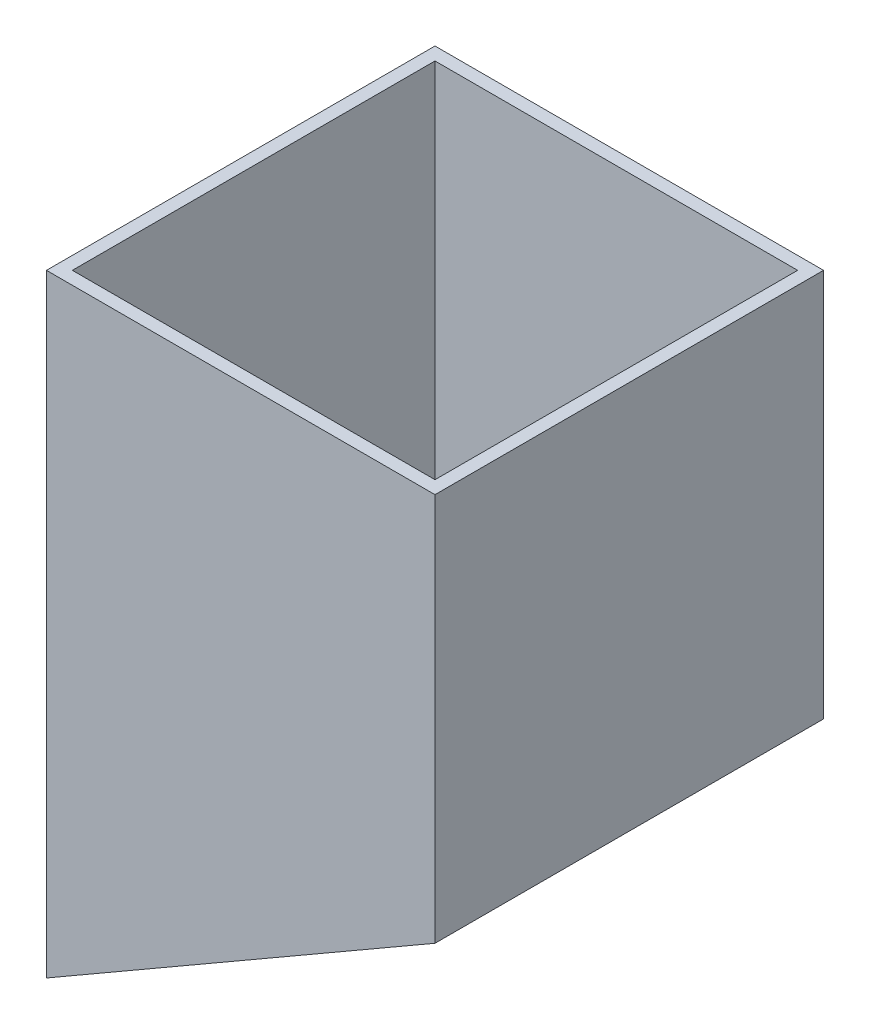
ISO-10303-21;
HEADER;
FILE_DESCRIPTION(('STEP AP214'),'2;1');
FILE_NAME('part.step','',(''),(''),'','','');
FILE_SCHEMA(('AUTOMOTIVE_DESIGN { 1 0 10303 214 1 1 1 1 }'));
ENDSEC;
DATA;
#1=APPLICATION_CONTEXT('core data for automotive mechanical design processes');
#2=APPLICATION_PROTOCOL_DEFINITION('international standard','automotive_design',2000,#1);
#3=PRODUCT_CONTEXT('',#1,'mechanical');
#4=PRODUCT('Part','Part','',(#3));
#5=PRODUCT_RELATED_PRODUCT_CATEGORY('part','',(#4));
#6=PRODUCT_DEFINITION_FORMATION('','',#4);
#7=PRODUCT_DEFINITION_CONTEXT('part definition',#1,'design');
#8=PRODUCT_DEFINITION('design','',#6,#7);
#9=PRODUCT_DEFINITION_SHAPE('','',#8);
#10=(LENGTH_UNIT() NAMED_UNIT(*) SI_UNIT(.MILLI.,.METRE.));
#11=(NAMED_UNIT(*) PLANE_ANGLE_UNIT() SI_UNIT($,.RADIAN.));
#12=(NAMED_UNIT(*) SI_UNIT($,.STERADIAN.) SOLID_ANGLE_UNIT());
#13=UNCERTAINTY_MEASURE_WITH_UNIT(LENGTH_MEASURE(1.E-05),#10,'distance_accuracy_value','');
#14=(GEOMETRIC_REPRESENTATION_CONTEXT(3) GLOBAL_UNCERTAINTY_ASSIGNED_CONTEXT((#13)) GLOBAL_UNIT_ASSIGNED_CONTEXT((#10,
#11,#12)) REPRESENTATION_CONTEXT('',''));
#15=CARTESIAN_POINT('',(0.,0.,0.));
#16=DIRECTION('',(0.,0.,1.));
#17=DIRECTION('',(1.,0.,0.));
#18=AXIS2_PLACEMENT_3D('',#15,#16,#17);
#19=CARTESIAN_POINT('',(0.,300.,0.));
#20=DIRECTION('',(0.,-1.,0.));
#21=DIRECTION('',(0.,0.,-1.));
#22=AXIS2_PLACEMENT_3D('',#19,#20,#21);
#23=PLANE('',#22);
#24=DIRECTION('',(0.,0.,1.));
#25=VECTOR('',#24,1.);
#26=CARTESIAN_POINT('',(0.,300.,0.));
#27=LINE('',#26,#25);
#28=CARTESIAN_POINT('',(0.,300.,-300.));
#29=VERTEX_POINT('',#28);
#30=CARTESIAN_POINT('',(0.,300.,0.));
#31=VERTEX_POINT('',#30);
#32=EDGE_CURVE('E94',#29,#31,#27,.T.);
#33=ORIENTED_EDGE('',*,*,#32,.T.);
#34=DIRECTION('',(1.,0.,0.));
#35=VECTOR('',#34,1.);
#36=CARTESIAN_POINT('',(0.,300.,0.));
#37=LINE('',#36,#35);
#38=CARTESIAN_POINT('',(300.,300.,0.));
#39=VERTEX_POINT('',#38);
#40=EDGE_CURVE('E88',#31,#39,#37,.T.);
#41=ORIENTED_EDGE('',*,*,#40,.T.);
#42=DIRECTION('',(0.,0.,-1.));
#43=VECTOR('',#42,1.);
#44=CARTESIAN_POINT('',(300.,300.,0.));
#45=LINE('',#44,#43);
#46=CARTESIAN_POINT('',(300.,300.,-300.));
#47=VERTEX_POINT('',#46);
#48=EDGE_CURVE('E91',#39,#47,#45,.T.);
#49=ORIENTED_EDGE('',*,*,#48,.T.);
#50=DIRECTION('',(-1.,0.,0.));
#51=VECTOR('',#50,1.);
#52=CARTESIAN_POINT('',(0.,300.,-300.));
#53=LINE('',#52,#51);
#54=EDGE_CURVE('E59',#47,#29,#53,.T.);
#55=ORIENTED_EDGE('',*,*,#54,.T.);
#56=EDGE_LOOP('',(#33,#41,#49,#55));
#57=FACE_BOUND('',#56,.T.);
#58=DIRECTION('',(0.,0.,1.));
#59=VECTOR('',#58,1.);
#60=CARTESIAN_POINT('',(10.,300.,0.));
#61=LINE('',#60,#59);
#62=CARTESIAN_POINT('',(9.99999999999995,300.,-290.));
#63=VERTEX_POINT('',#62);
#64=CARTESIAN_POINT('',(10.,300.,-10.));
#65=VERTEX_POINT('',#64);
#66=EDGE_CURVE('E129',#63,#65,#61,.T.);
#67=ORIENTED_EDGE('',*,*,#66,.F.);
#68=DIRECTION('',(-1.,0.,0.));
#69=VECTOR('',#68,1.);
#70=CARTESIAN_POINT('',(0.,300.,-290.));
#71=LINE('',#70,#69);
#72=CARTESIAN_POINT('',(290.,300.,-290.));
#73=VERTEX_POINT('',#72);
#74=EDGE_CURVE('E121',#73,#63,#71,.T.);
#75=ORIENTED_EDGE('',*,*,#74,.F.);
#76=DIRECTION('',(0.,0.,-1.));
#77=VECTOR('',#76,1.);
#78=CARTESIAN_POINT('',(290.,300.,0.));
#79=LINE('',#78,#77);
#80=CARTESIAN_POINT('',(290.,300.,-10.));
#81=VERTEX_POINT('',#80);
#82=EDGE_CURVE('E124',#81,#73,#79,.T.);
#83=ORIENTED_EDGE('',*,*,#82,.F.);
#84=DIRECTION('',(1.,0.,0.));
#85=VECTOR('',#84,1.);
#86=CARTESIAN_POINT('',(0.,300.,-10.));
#87=LINE('',#86,#85);
#88=EDGE_CURVE('E126',#65,#81,#87,.T.);
#89=ORIENTED_EDGE('',*,*,#88,.F.);
#90=EDGE_LOOP('',(#67,#75,#83,#89));
#91=FACE_BOUND('',#90,.T.);
#92=ADVANCED_FACE('F35',(#57,#91),#23,.F.);
#93=CARTESIAN_POINT('',(0.,300.,0.));
#94=DIRECTION('',(1.,0.,0.));
#95=DIRECTION('',(0.,0.,-1.));
#96=AXIS2_PLACEMENT_3D('',#93,#94,#95);
#97=PLANE('',#96);
#98=DIRECTION('',(0.,-1.,0.));
#99=VECTOR('',#98,1.);
#100=CARTESIAN_POINT('',(0.,300.,-300.));
#101=LINE('',#100,#99);
#102=CARTESIAN_POINT('',(0.,-173.205080756885,-300.));
#103=VERTEX_POINT('',#102);
#104=EDGE_CURVE('E104',#29,#103,#101,.T.);
#105=ORIENTED_EDGE('',*,*,#104,.T.);
#106=DIRECTION('',(0.,0.,1.));
#107=VECTOR('',#106,1.);
#108=CARTESIAN_POINT('',(0.,-173.205080756885,-646.410161513774));
#109=LINE('',#108,#107);
#110=CARTESIAN_POINT('',(0.,-173.205080756885,0.));
#111=VERTEX_POINT('',#110);
#112=EDGE_CURVE('E116',#103,#111,#109,.T.);
#113=ORIENTED_EDGE('',*,*,#112,.T.);
#114=DIRECTION('',(0.,-1.,0.));
#115=VECTOR('',#114,1.);
#116=CARTESIAN_POINT('',(0.,300.,0.));
#117=LINE('',#116,#115);
#118=EDGE_CURVE('E11',#31,#111,#117,.T.);
#119=ORIENTED_EDGE('',*,*,#118,.F.);
#120=ORIENTED_EDGE('',*,*,#32,.F.);
#121=EDGE_LOOP('',(#105,#113,#119,#120));
#122=FACE_BOUND('',#121,.T.);
#123=ADVANCED_FACE('F37',(#122),#97,.F.);
#124=CARTESIAN_POINT('',(0.,300.,0.));
#125=DIRECTION('',(0.,0.,-1.));
#126=DIRECTION('',(-1.,0.,0.));
#127=AXIS2_PLACEMENT_3D('',#124,#125,#126);
#128=PLANE('',#127);
#129=ORIENTED_EDGE('',*,*,#118,.T.);
#130=DIRECTION('',(0.866025403784441,0.499999999999995,0.));
#131=VECTOR('',#130,1.);
#132=CARTESIAN_POINT('',(0.,-173.205080756885,0.));
#133=LINE('',#132,#131);
#134=CARTESIAN_POINT('',(300.,0.,0.));
#135=VERTEX_POINT('',#134);
#136=EDGE_CURVE('E71',#111,#135,#133,.T.);
#137=ORIENTED_EDGE('',*,*,#136,.T.);
#138=DIRECTION('',(0.,-1.,0.));
#139=VECTOR('',#138,1.);
#140=CARTESIAN_POINT('',(300.,300.,0.));
#141=LINE('',#140,#139);
#142=EDGE_CURVE('E43',#39,#135,#141,.T.);
#143=ORIENTED_EDGE('',*,*,#142,.F.);
#144=ORIENTED_EDGE('',*,*,#40,.F.);
#145=EDGE_LOOP('',(#129,#137,#143,#144));
#146=FACE_BOUND('',#145,.T.);
#147=ADVANCED_FACE('F98',(#146),#128,.F.);
#148=CARTESIAN_POINT('',(300.,300.,0.));
#149=DIRECTION('',(-1.,0.,0.));
#150=DIRECTION('',(0.,0.,1.));
#151=AXIS2_PLACEMENT_3D('',#148,#149,#150);
#152=PLANE('',#151);
#153=DIRECTION('',(0.,0.,-1.));
#154=VECTOR('',#153,1.);
#155=CARTESIAN_POINT('',(300.,0.,0.));
#156=LINE('',#155,#154);
#157=CARTESIAN_POINT('',(300.,0.,-300.));
#158=VERTEX_POINT('',#157);
#159=EDGE_CURVE('E108',#135,#158,#156,.T.);
#160=ORIENTED_EDGE('',*,*,#159,.T.);
#161=DIRECTION('',(0.,-1.,0.));
#162=VECTOR('',#161,1.);
#163=CARTESIAN_POINT('',(300.,300.,-300.));
#164=LINE('',#163,#162);
#165=EDGE_CURVE('E100',#47,#158,#164,.T.);
#166=ORIENTED_EDGE('',*,*,#165,.F.);
#167=ORIENTED_EDGE('',*,*,#48,.F.);
#168=ORIENTED_EDGE('',*,*,#142,.T.);
#169=EDGE_LOOP('',(#160,#166,#167,#168));
#170=FACE_BOUND('',#169,.T.);
#171=ADVANCED_FACE('F101',(#170),#152,.F.);
#172=CARTESIAN_POINT('',(0.,300.,-300.));
#173=DIRECTION('',(0.,0.,1.));
#174=DIRECTION('',(1.,0.,0.));
#175=AXIS2_PLACEMENT_3D('',#172,#173,#174);
#176=PLANE('',#175);
#177=ORIENTED_EDGE('',*,*,#165,.T.);
#178=DIRECTION('',(-0.866025403784442,-0.499999999999995,0.));
#179=VECTOR('',#178,1.);
#180=CARTESIAN_POINT('',(0.,-173.205080756885,-300.));
#181=LINE('',#180,#179);
#182=EDGE_CURVE('E81',#158,#103,#181,.T.);
#183=ORIENTED_EDGE('',*,*,#182,.T.);
#184=ORIENTED_EDGE('',*,*,#104,.F.);
#185=ORIENTED_EDGE('',*,*,#54,.F.);
#186=EDGE_LOOP('',(#177,#183,#184,#185));
#187=FACE_BOUND('',#186,.T.);
#188=ADVANCED_FACE('F112',(#187),#176,.F.);
#189=CARTESIAN_POINT('',(0.,-173.205080756885,-646.410161513774));
#190=DIRECTION('',(0.499999999999995,-0.866025403784442,0.));
#191=DIRECTION('',(0.866025403784442,0.499999999999995,0.));
#192=AXIS2_PLACEMENT_3D('',#189,#190,#191);
#193=PLANE('',#192);
#194=ORIENTED_EDGE('',*,*,#182,.F.);
#195=ORIENTED_EDGE('',*,*,#159,.F.);
#196=ORIENTED_EDGE('',*,*,#136,.F.);
#197=ORIENTED_EDGE('',*,*,#112,.F.);
#198=EDGE_LOOP('',(#194,#195,#196,#197));
#199=FACE_BOUND('',#198,.T.);
#200=ADVANCED_FACE('F184',(#199),#193,.T.);
#201=CARTESIAN_POINT('',(10.,300.,0.));
#202=DIRECTION('',(1.,0.,0.));
#203=DIRECTION('',(0.,0.,-1.));
#204=AXIS2_PLACEMENT_3D('',#201,#202,#203);
#205=PLANE('',#204);
#206=DIRECTION('',(0.,-1.,0.));
#207=VECTOR('',#206,1.);
#208=CARTESIAN_POINT('',(9.99999999999995,300.,-290.));
#209=LINE('',#208,#207);
#210=CARTESIAN_POINT('',(9.99999999999995,-155.884572681197,-290.));
#211=VERTEX_POINT('',#210);
#212=EDGE_CURVE('E123',#63,#211,#209,.T.);
#213=ORIENTED_EDGE('',*,*,#212,.F.);
#214=ORIENTED_EDGE('',*,*,#66,.T.);
#215=DIRECTION('',(0.,-1.,0.));
#216=VECTOR('',#215,1.);
#217=CARTESIAN_POINT('',(10.,300.,-10.));
#218=LINE('',#217,#216);
#219=CARTESIAN_POINT('',(10.,-155.884572681197,-10.));
#220=VERTEX_POINT('',#219);
#221=EDGE_CURVE('E119',#65,#220,#218,.T.);
#222=ORIENTED_EDGE('',*,*,#221,.T.);
#223=DIRECTION('',(0.,0.,1.));
#224=VECTOR('',#223,1.);
#225=CARTESIAN_POINT('',(9.99999999999988,-155.884572681197,-646.410161513774));
#226=LINE('',#225,#224);
#227=EDGE_CURVE('E136',#211,#220,#226,.T.);
#228=ORIENTED_EDGE('',*,*,#227,.F.);
#229=EDGE_LOOP('',(#213,#214,#222,#228));
#230=FACE_BOUND('',#229,.T.);
#231=ADVANCED_FACE('F166',(#230),#205,.T.);
#232=CARTESIAN_POINT('',(0.,300.,-10.));
#233=DIRECTION('',(0.,0.,-1.));
#234=DIRECTION('',(-1.,0.,0.));
#235=AXIS2_PLACEMENT_3D('',#232,#233,#234);
#236=PLANE('',#235);
#237=ORIENTED_EDGE('',*,*,#221,.F.);
#238=ORIENTED_EDGE('',*,*,#88,.T.);
#239=DIRECTION('',(0.,-1.,0.));
#240=VECTOR('',#239,1.);
#241=CARTESIAN_POINT('',(290.,300.,-10.));
#242=LINE('',#241,#240);
#243=CARTESIAN_POINT('',(290.,5.77350269189627,-10.));
#244=VERTEX_POINT('',#243);
#245=EDGE_CURVE('E138',#81,#244,#242,.T.);
#246=ORIENTED_EDGE('',*,*,#245,.T.);
#247=DIRECTION('',(0.866025403784442,0.499999999999995,0.));
#248=VECTOR('',#247,1.);
#249=CARTESIAN_POINT('',(-4.99999999999993,-164.544826719041,-10.));
#250=LINE('',#249,#248);
#251=EDGE_CURVE('E143',#220,#244,#250,.T.);
#252=ORIENTED_EDGE('',*,*,#251,.F.);
#253=EDGE_LOOP('',(#237,#238,#246,#252));
#254=FACE_BOUND('',#253,.T.);
#255=ADVANCED_FACE('F172',(#254),#236,.T.);
#256=CARTESIAN_POINT('',(290.,300.,0.));
#257=DIRECTION('',(-1.,0.,0.));
#258=DIRECTION('',(0.,0.,1.));
#259=AXIS2_PLACEMENT_3D('',#256,#257,#258);
#260=PLANE('',#259);
#261=DIRECTION('',(0.,0.,-1.));
#262=VECTOR('',#261,1.);
#263=CARTESIAN_POINT('',(290.,5.77350269189628,-646.410161513774));
#264=LINE('',#263,#262);
#265=CARTESIAN_POINT('',(290.,5.77350269189627,-290.));
#266=VERTEX_POINT('',#265);
#267=EDGE_CURVE('E132',#244,#266,#264,.T.);
#268=ORIENTED_EDGE('',*,*,#267,.F.);
#269=ORIENTED_EDGE('',*,*,#245,.F.);
#270=ORIENTED_EDGE('',*,*,#82,.T.);
#271=DIRECTION('',(0.,-1.,0.));
#272=VECTOR('',#271,1.);
#273=CARTESIAN_POINT('',(290.,300.,-290.));
#274=LINE('',#273,#272);
#275=EDGE_CURVE('E50',#73,#266,#274,.T.);
#276=ORIENTED_EDGE('',*,*,#275,.T.);
#277=EDGE_LOOP('',(#268,#269,#270,#276));
#278=FACE_BOUND('',#277,.T.);
#279=ADVANCED_FACE('F180',(#278),#260,.T.);
#280=CARTESIAN_POINT('',(0.,300.,-290.));
#281=DIRECTION('',(0.,0.,1.));
#282=DIRECTION('',(1.,0.,0.));
#283=AXIS2_PLACEMENT_3D('',#280,#281,#282);
#284=PLANE('',#283);
#285=ORIENTED_EDGE('',*,*,#275,.F.);
#286=ORIENTED_EDGE('',*,*,#74,.T.);
#287=ORIENTED_EDGE('',*,*,#212,.T.);
#288=DIRECTION('',(-0.866025403784442,-0.499999999999995,0.));
#289=VECTOR('',#288,1.);
#290=CARTESIAN_POINT('',(-4.99999999999993,-164.544826719041,-290.));
#291=LINE('',#290,#289);
#292=EDGE_CURVE('E133',#266,#211,#291,.T.);
#293=ORIENTED_EDGE('',*,*,#292,.F.);
#294=EDGE_LOOP('',(#285,#286,#287,#293));
#295=FACE_BOUND('',#294,.T.);
#296=ADVANCED_FACE('F153',(#295),#284,.T.);
#297=CARTESIAN_POINT('',(-4.99999999999993,-164.544826719041,-646.410161513774));
#298=DIRECTION('',(0.499999999999995,-0.866025403784442,0.));
#299=DIRECTION('',(0.866025403784442,0.499999999999995,0.));
#300=AXIS2_PLACEMENT_3D('',#297,#298,#299);
#301=PLANE('',#300);
#302=ORIENTED_EDGE('',*,*,#292,.T.);
#303=ORIENTED_EDGE('',*,*,#227,.T.);
#304=ORIENTED_EDGE('',*,*,#251,.T.);
#305=ORIENTED_EDGE('',*,*,#267,.T.);
#306=EDGE_LOOP('',(#302,#303,#304,#305));
#307=FACE_BOUND('',#306,.T.);
#308=ADVANCED_FACE('F163',(#307),#301,.F.);
#309=CLOSED_SHELL('',(#92,#123,#147,#171,#188,#200,#231,#255,#279,#296,#308));
#310=MANIFOLD_SOLID_BREP('B2',#309);
#311=ADVANCED_BREP_SHAPE_REPRESENTATION('',(#18,#310),#14);
#312=SHAPE_DEFINITION_REPRESENTATION(#9,#311);
ENDSEC;
END-ISO-10303-21;
